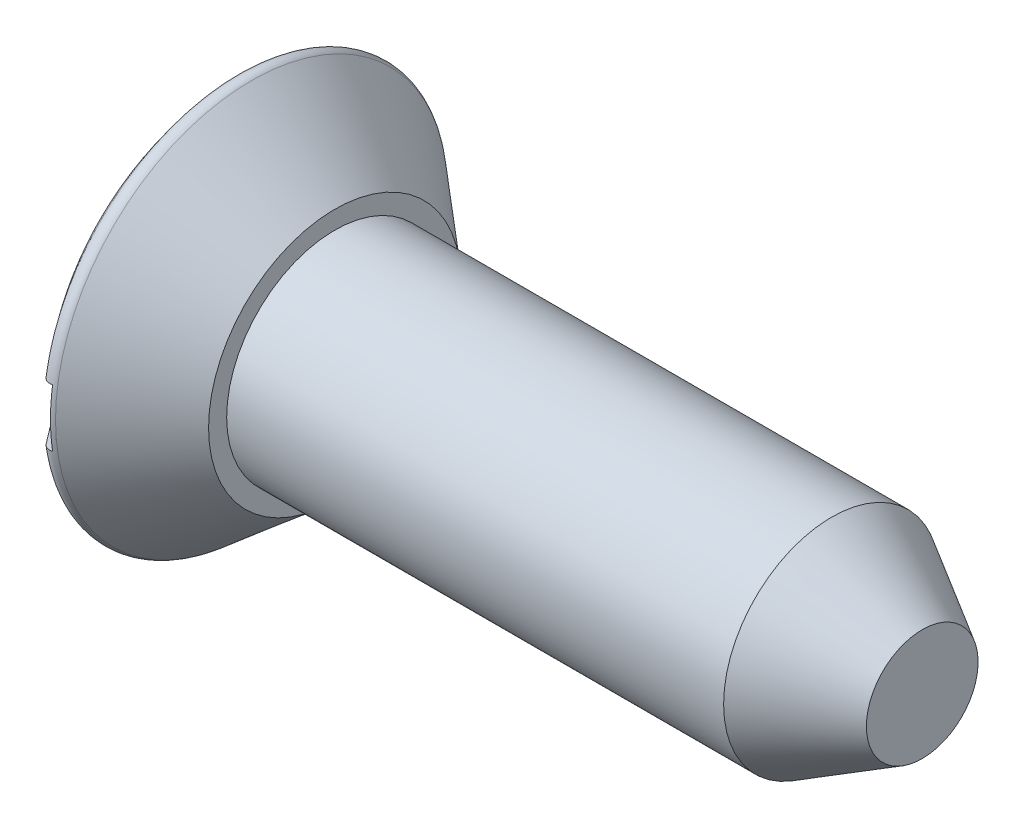
ISO-10303-21;
HEADER;
FILE_DESCRIPTION(('STEP AP214'),'2;1');
FILE_NAME('part.step','',(''),(''),'','','');
FILE_SCHEMA(('AUTOMOTIVE_DESIGN { 1 0 10303 214 1 1 1 1 }'));
ENDSEC;
DATA;
#1=APPLICATION_CONTEXT('core data for automotive mechanical design processes');
#2=APPLICATION_PROTOCOL_DEFINITION('international standard','automotive_design',2000,#1);
#3=PRODUCT_CONTEXT('',#1,'mechanical');
#4=PRODUCT('Part','Part','',(#3));
#5=PRODUCT_RELATED_PRODUCT_CATEGORY('part','',(#4));
#6=PRODUCT_DEFINITION_FORMATION('','',#4);
#7=PRODUCT_DEFINITION_CONTEXT('part definition',#1,'design');
#8=PRODUCT_DEFINITION('design','',#6,#7);
#9=PRODUCT_DEFINITION_SHAPE('','',#8);
#10=(LENGTH_UNIT() NAMED_UNIT(*) SI_UNIT(.MILLI.,.METRE.));
#11=(NAMED_UNIT(*) PLANE_ANGLE_UNIT() SI_UNIT($,.RADIAN.));
#12=(NAMED_UNIT(*) SI_UNIT($,.STERADIAN.) SOLID_ANGLE_UNIT());
#13=UNCERTAINTY_MEASURE_WITH_UNIT(LENGTH_MEASURE(1.E-05),#10,'distance_accuracy_value','');
#14=(GEOMETRIC_REPRESENTATION_CONTEXT(3) GLOBAL_UNCERTAINTY_ASSIGNED_CONTEXT((#13)) GLOBAL_UNIT_ASSIGNED_CONTEXT((#10,
#11,#12)) REPRESENTATION_CONTEXT('',''));
#15=CARTESIAN_POINT('',(0.,0.,0.));
#16=DIRECTION('',(0.,0.,1.));
#17=DIRECTION('',(1.,0.,0.));
#18=AXIS2_PLACEMENT_3D('',#15,#16,#17);
#19=CARTESIAN_POINT('',(0.,0.,0.));
#20=DIRECTION('',(-1.,0.,0.));
#21=DIRECTION('',(0.,0.,1.));
#22=AXIS2_PLACEMENT_3D('',#19,#20,#21);
#23=CYLINDRICAL_SURFACE('',#22,0.762);
#24=CARTESIAN_POINT('',(0.635,0.,0.));
#25=DIRECTION('',(-1.,0.,0.));
#26=DIRECTION('',(0.,0.,1.));
#27=AXIS2_PLACEMENT_3D('',#24,#25,#26);
#28=CIRCLE('',#27,0.762);
#29=CARTESIAN_POINT('',(0.635,0.,0.762));
#30=VERTEX_POINT('',#29);
#31=EDGE_CURVE('E152',#30,#30,#28,.T.);
#32=ORIENTED_EDGE('',*,*,#31,.F.);
#33=EDGE_LOOP('',(#32));
#34=FACE_BOUND('',#33,.T.);
#35=CARTESIAN_POINT('',(4.13728568757237,0.,0.));
#36=DIRECTION('',(-1.,0.,0.));
#37=DIRECTION('',(0.,0.,1.));
#38=AXIS2_PLACEMENT_3D('',#35,#36,#37);
#39=CIRCLE('',#38,0.762);
#40=CARTESIAN_POINT('',(4.13728568757237,0.,0.762));
#41=VERTEX_POINT('',#40);
#42=EDGE_CURVE('E182',#41,#41,#39,.T.);
#43=ORIENTED_EDGE('',*,*,#42,.T.);
#44=EDGE_LOOP('',(#43));
#45=FACE_BOUND('',#44,.T.);
#46=ADVANCED_FACE('F68',(#34,#45),#23,.T.);
#47=CARTESIAN_POINT('',(1.62983333333333,0.,0.));
#48=DIRECTION('',(-1.,0.,0.));
#49=DIRECTION('',(0.,1.,0.));
#50=AXIS2_PLACEMENT_3D('',#47,#48,#49);
#51=SPHERICAL_SURFACE('',#50,2.16323333333333);
#52=CARTESIAN_POINT('',(-0.0414603916577194,0.,0.));
#53=DIRECTION('',(-1.,0.,0.));
#54=DIRECTION('',(0.,0.,1.));
#55=AXIS2_PLACEMENT_3D('',#52,#53,#54);
#56=CIRCLE('',#55,1.37344666414462);
#57=CARTESIAN_POINT('',(-0.0414603916577233,0.2032,1.35833188111374));
#58=VERTEX_POINT('',#57);
#59=CARTESIAN_POINT('',(-0.0414603916577194,0.2032,-1.35833188111373));
#60=VERTEX_POINT('',#59);
#61=EDGE_CURVE('E162',#58,#60,#56,.T.);
#62=ORIENTED_EDGE('',*,*,#61,.T.);
#63=CARTESIAN_POINT('',(1.62983333333333,0.2032,0.));
#64=DIRECTION('',(0.,1.,0.));
#65=DIRECTION('',(0.,0.,1.));
#66=AXIS2_PLACEMENT_3D('',#63,#64,#65);
#67=CIRCLE('',#66,2.15366854795357);
#68=EDGE_CURVE('E95',#60,#58,#67,.T.);
#69=ORIENTED_EDGE('',*,*,#68,.T.);
#70=EDGE_LOOP('',(#62,#69));
#71=FACE_BOUND('',#70,.T.);
#72=ADVANCED_FACE('F178',(#71),#51,.T.);
#73=CARTESIAN_POINT('',(-0.0414603916577194,-0.2032,-1.35833188111373));
#74=VERTEX_POINT('',#73);
#75=CARTESIAN_POINT('',(-0.0414603916577194,-0.2032,1.35833188111373));
#76=VERTEX_POINT('',#75);
#77=EDGE_CURVE('E132',#74,#76,#56,.T.);
#78=ORIENTED_EDGE('',*,*,#77,.T.);
#79=CARTESIAN_POINT('',(1.62983333333333,-0.2032,0.));
#80=DIRECTION('',(0.,-1.,0.));
#81=DIRECTION('',(0.,0.,-1.));
#82=AXIS2_PLACEMENT_3D('',#79,#80,#81);
#83=CIRCLE('',#82,2.15366854795357);
#84=EDGE_CURVE('E87',#76,#74,#83,.T.);
#85=ORIENTED_EDGE('',*,*,#84,.T.);
#86=EDGE_LOOP('',(#78,#85));
#87=FACE_BOUND('',#86,.T.);
#88=ADVANCED_FACE('F70',(#87),#51,.T.);
#89=CARTESIAN_POINT('',(0.635,0.889571734202426,0.));
#90=DIRECTION('',(-1.,0.,0.));
#91=DIRECTION('',(0.,0.,1.));
#92=AXIS2_PLACEMENT_3D('',#89,#90,#91);
#93=PLANE('',#92);
#94=CARTESIAN_POINT('',(0.635,0.,0.));
#95=DIRECTION('',(-1.,0.,0.));
#96=DIRECTION('',(0.,0.,1.));
#97=AXIS2_PLACEMENT_3D('',#94,#95,#96);
#98=CIRCLE('',#97,0.889571734202426);
#99=CARTESIAN_POINT('',(0.635,0.,0.889571734202426));
#100=VERTEX_POINT('',#99);
#101=EDGE_CURVE('E167',#100,#100,#98,.T.);
#102=ORIENTED_EDGE('',*,*,#101,.F.);
#103=EDGE_LOOP('',(#102));
#104=FACE_BOUND('',#103,.T.);
#105=ORIENTED_EDGE('',*,*,#31,.T.);
#106=EDGE_LOOP('',(#105));
#107=FACE_BOUND('',#106,.T.);
#108=ADVANCED_FACE('F174',(#104,#107),#93,.F.);
#109=CARTESIAN_POINT('',(0.635,0.,0.));
#110=DIRECTION('',(-1.,0.,0.));
#111=DIRECTION('',(0.,0.,1.));
#112=AXIS2_PLACEMENT_3D('',#109,#110,#111);
#113=CONICAL_SURFACE('',#112,0.889571734202426,0.698131700797733);
#114=CARTESIAN_POINT('',(0.0484161242479158,0.,0.));
#115=DIRECTION('',(-1.,0.,0.));
#116=DIRECTION('',(0.,0.,1.));
#117=AXIS2_PLACEMENT_3D('',#114,#115,#116);
#118=CIRCLE('',#117,1.38177404800054);
#119=CARTESIAN_POINT('',(0.0484161242479158,0.,1.38177404800054));
#120=VERTEX_POINT('',#119);
#121=EDGE_CURVE('E165',#120,#120,#118,.T.);
#122=ORIENTED_EDGE('',*,*,#121,.F.);
#123=EDGE_LOOP('',(#122));
#124=FACE_BOUND('',#123,.T.);
#125=ORIENTED_EDGE('',*,*,#101,.T.);
#126=EDGE_LOOP('',(#125));
#127=FACE_BOUND('',#126,.T.);
#128=ADVANCED_FACE('F196',(#124,#127),#113,.T.);
#129=CARTESIAN_POINT('',(0.00759911103282043,0.,0.));
#130=DIRECTION('',(-1.,0.,0.));
#131=DIRECTION('',(0.,0.,1.));
#132=AXIS2_PLACEMENT_3D('',#129,#130,#131);
#133=TOROIDAL_SURFACE('',#132,1.33313022586249,0.0635000000000001);
#134=CARTESIAN_POINT('',(0.0253999999999999,0.,0.));
#135=DIRECTION('',(1.,0.,0.));
#136=DIRECTION('',(0.,0.,-1.));
#137=AXIS2_PLACEMENT_3D('',#134,#135,#136);
#138=CIRCLE('',#137,1.39408412936323);
#139=CARTESIAN_POINT('',(0.0253999999999999,-0.2032,-1.37919553354208));
#140=VERTEX_POINT('',#139);
#141=CARTESIAN_POINT('',(0.0253999999999999,0.2032,-1.37919553354208));
#142=VERTEX_POINT('',#141);
#143=EDGE_CURVE('E80',#140,#142,#138,.T.);
#144=ORIENTED_EDGE('',*,*,#143,.T.);
#145=CARTESIAN_POINT('',(-0.0280765606748768,0.2032,-1.37068105040169));
#146=CARTESIAN_POINT('',(-0.0310388679205371,0.2032,-1.36864704682959));
#147=CARTESIAN_POINT('',(-0.0338302754665,0.2032,-1.36635921237093));
#148=CARTESIAN_POINT('',(-0.0389903860065036,0.2032,-1.36134417556376));
#149=CARTESIAN_POINT('',(-0.0413585230776918,0.2032,-1.35861639412375));
#150=CARTESIAN_POINT('',(-0.0456025082425014,0.2032,-1.35280526417098));
#151=CARTESIAN_POINT('',(-0.0474788169070188,0.2032,-1.34972225223628));
#152=CARTESIAN_POINT('',(-0.0506912878001431,0.2032,-1.34328786635741));
#153=CARTESIAN_POINT('',(-0.0520275832813946,0.2032,-1.3399365588622));
#154=CARTESIAN_POINT('',(-0.0541344174369653,0.2032,-1.33303161601037));
#155=CARTESIAN_POINT('',(-0.0549004049946464,0.2032,-1.32947659186684));
#156=CARTESIAN_POINT('',(-0.0558294735501169,0.2032,-1.32228842416333));
#157=CARTESIAN_POINT('',(-0.0559925006292517,0.2032,-1.31865527364625));
#158=CARTESIAN_POINT('',(-0.0557106086385143,0.2032,-1.31138620185728));
#159=CARTESIAN_POINT('',(-0.0552612832926854,0.2032,-1.30775045065601));
#160=CARTESIAN_POINT('',(-0.0537590054653143,0.2032,-1.30060577782505));
#161=CARTESIAN_POINT('',(-0.0527060443568764,0.2032,-1.29709685800872));
#162=CARTESIAN_POINT('',(-0.0500240738926529,0.2032,-1.2903045704047));
#163=CARTESIAN_POINT('',(-0.0483948077919105,0.2032,-1.28702130392586));
#164=CARTESIAN_POINT('',(-0.0446044004369154,0.2032,-1.28077753225855));
#165=CARTESIAN_POINT('',(-0.0424432758356357,0.2032,-1.27781701696863));
#166=CARTESIAN_POINT('',(-0.0376660032020217,0.2032,-1.27232642500552));
#167=CARTESIAN_POINT('',(-0.0350532247429569,0.2032,-1.26979341751435));
#168=CARTESIAN_POINT('',(-0.029435011692653,0.2032,-1.26520842235457));
#169=CARTESIAN_POINT('',(-0.0264296023364173,0.2032,-1.26315640379572));
#170=CARTESIAN_POINT('',(-0.0201498097731999,0.2032,-1.25961788879214));
#171=CARTESIAN_POINT('',(-0.0168790665879256,0.2032,-1.2581249325384));
#172=CARTESIAN_POINT('',(-0.0101314985991322,0.2032,-1.25571637499513));
#173=CARTESIAN_POINT('',(-0.00665468820921032,0.2032,-1.2548007333767));
#174=CARTESIAN_POINT('',(0.000364825472034765,0.2032,-1.25358223307953));
#175=CARTESIAN_POINT('',(0.00390636824961993,0.2032,-1.25327268232582));
#176=CARTESIAN_POINT('',(0.0109908268871647,0.2032,-1.2532556924413));
#177=CARTESIAN_POINT('',(0.0145337426904779,0.2032,-1.25354823066725));
#178=CARTESIAN_POINT('',(0.0215028765950578,0.2032,-1.25472350981883));
#179=CARTESIAN_POINT('',(0.024929567849622,0.2032,-1.25560344941438));
#180=CARTESIAN_POINT('',(0.0315874578170289,0.2032,-1.2579239253121));
#181=CARTESIAN_POINT('',(0.0348186545514337,0.2032,-1.25936446728656));
#182=CARTESIAN_POINT('',(0.0410084024777361,0.2032,-1.26276984031255));
#183=CARTESIAN_POINT('',(0.0439658226680158,0.2032,-1.26473672608508));
#184=CARTESIAN_POINT('',(0.0495129281379218,0.2032,-1.26913422734472));
#185=CARTESIAN_POINT('',(0.0521025950569031,0.2032,-1.2715648659712));
#186=CARTESIAN_POINT('',(0.0568703559165243,0.2032,-1.27684798358896));
#187=CARTESIAN_POINT('',(0.0590438025306411,0.2032,-1.27970465596199));
#188=CARTESIAN_POINT('',(0.0628870373935519,0.2032,-1.28573874910478));
#189=CARTESIAN_POINT('',(0.0645567928447215,0.2032,-1.28891619074332));
#190=CARTESIAN_POINT('',(0.0673659648193111,0.2032,-1.29554283760898));
#191=CARTESIAN_POINT('',(0.0684987387378092,0.2032,-1.29899485948694));
#192=CARTESIAN_POINT('',(0.0701738961256293,0.2032,-1.30603933165563));
#193=CARTESIAN_POINT('',(0.0707162488452721,0.2032,-1.30963178925029));
#194=CARTESIAN_POINT('',(0.0711980469296698,0.2032,-1.31688608794474));
#195=CARTESIAN_POINT('',(0.0711326023890148,0.2032,-1.32054825480709));
#196=CARTESIAN_POINT('',(0.0703883960709238,0.2032,-1.32780981355696));
#197=CARTESIAN_POINT('',(0.0697096252768468,0.2032,-1.33140920452082));
#198=CARTESIAN_POINT('',(0.0677556833471742,0.2032,-1.33844529346164));
#199=CARTESIAN_POINT('',(0.0664800735838632,0.2032,-1.34188186973416));
#200=CARTESIAN_POINT('',(0.0633663619570054,0.2032,-1.34849009973695));
#201=CARTESIAN_POINT('',(0.0615282737359145,0.2032,-1.35166175989016));
#202=CARTESIAN_POINT('',(0.0573534868530262,0.2032,-1.35762753971678));
#203=CARTESIAN_POINT('',(0.0550200774896427,0.2032,-1.36042396050964));
#204=CARTESIAN_POINT('',(0.0499123916903922,0.2032,-1.36558019312128));
#205=CARTESIAN_POINT('',(0.0471381387907165,0.2032,-1.36794002823437));
#206=CARTESIAN_POINT('',(0.041258526754193,0.2032,-1.37212965180808));
#207=CARTESIAN_POINT('',(0.0381569335218169,0.2032,-1.37396472512534));
#208=CARTESIAN_POINT('',(0.0316874580432662,0.2032,-1.37708192659846));
#209=CARTESIAN_POINT('',(0.0283196023065038,0.2032,-1.3783641097189));
#210=CARTESIAN_POINT('',(0.0214497417901072,0.2032,-1.38032643506428));
#211=CARTESIAN_POINT('',(0.0179494359893005,0.2032,-1.38101252858432));
#212=CARTESIAN_POINT('',(0.0108822865252818,0.2032,-1.38178380384242));
#213=CARTESIAN_POINT('',(0.00731542872721301,0.2032,-1.38186885643576));
#214=CARTESIAN_POINT('',(0.00023700489406997,0.2032,-1.38143643711581));
#215=CARTESIAN_POINT('',(-0.00327474961133865,0.2032,-1.38092201237615));
#216=CARTESIAN_POINT('',(-0.0101589951476675,0.2032,-1.37931130423865));
#217=CARTESIAN_POINT('',(-0.0135316524495051,0.2032,-1.37821573859892));
#218=CARTESIAN_POINT('',(-0.0187672177826123,0.2032,-1.37601485477916));
#219=CARTESIAN_POINT('',(-0.0207041934593265,0.2032,-1.37508132393932));
#220=CARTESIAN_POINT('',(-0.0244733285264824,0.2032,-1.3730224553043));
#221=CARTESIAN_POINT('',(-0.0263054884417126,0.2032,-1.37189711846957));
#222=CARTESIAN_POINT('',(-0.0280765606748768,0.2032,-1.37068105040169));
#223=B_SPLINE_CURVE_WITH_KNOTS('',3,(#145,#146,#147,#148,#149,#150,#151,#152,#153,#154,#155,
#156,#157,#158,#159,#160,#161,#162,#163,#164,#165,#166,#167,#168,#169,#170,#171,#172,#173,#174,
#175,#176,#177,#178,#179,#180,#181,#182,#183,#184,#185,#186,#187,#188,#189,#190,#191,#192,#193,
#194,#195,#196,#197,#198,#199,#200,#201,#202,#203,#204,#205,#206,#207,#208,#209,#210,#211,#212,
#213,#214,#215,#216,#217,#218,#219,#220,#221,#222),.UNSPECIFIED.,.T.,.F.,(4,2,2,2,2,2,2,2,2,2,2,
2,2,2,2,2,2,2,2,2,2,2,2,2,2,2,2,2,2,2,2,2,2,2,2,2,2,2,4),(0.,0.0107722146404036,
0.021558725974208,0.0323350999387978,0.0431088131193548,0.0539676063176897,0.0648273705205705,
0.0757656918054064,0.0867041694197947,0.0976475262968263,0.108590540570994,0.119455184530107,
0.130319130544739,0.141053360662887,0.151786840847563,0.162401125041266,0.173015010062503,
0.18357863544707,0.194142367719457,0.204747955569302,0.215354072733335,0.226072470986027,
0.236791567011841,0.247640007886721,0.258489013731355,0.26942537811436,0.280361903277824,
0.291306478545819,0.302250788383111,0.313124574641122,0.323997780553591,0.334757280736064,
0.34551571103563,0.356165453598175,0.366817484384509,0.377415605674736,0.388000667763541,
0.394441075252375,0.40088145049274),.UNSPECIFIED.);
#224=EDGE_CURVE('E42',#142,#60,#223,.T.);
#225=ORIENTED_EDGE('',*,*,#224,.T.);
#226=ORIENTED_EDGE('',*,*,#61,.F.);
#227=CARTESIAN_POINT('',(0.00947622470481494,0.2032,1.25329211965426));
#228=CARTESIAN_POINT('',(0.00594649641936487,0.2032,1.25318653344214));
#229=CARTESIAN_POINT('',(0.00240523976672635,0.2032,1.2533798819006));
#230=CARTESIAN_POINT('',(-0.00459708761069851,0.2032,1.25435998755063));
#231=CARTESIAN_POINT('',(-0.00805805704335603,0.2032,1.25514745635103));
#232=CARTESIAN_POINT('',(-0.0147964383079594,0.2032,1.257291437433));
#233=CARTESIAN_POINT('',(-0.0180739824576047,0.2032,1.25864753336613));
#234=CARTESIAN_POINT('',(-0.0243556558523746,0.2032,1.26188748760626));
#235=CARTESIAN_POINT('',(-0.0273598455741683,0.2032,1.26377122879959));
#236=CARTESIAN_POINT('',(-0.0330294256675567,0.2032,1.26802277842461));
#237=CARTESIAN_POINT('',(-0.0356928593534142,0.2032,1.27039319524895));
#238=CARTESIAN_POINT('',(-0.0405898552652003,0.2032,1.27554288021782));
#239=CARTESIAN_POINT('',(-0.0428233773244971,0.2032,1.27832218652213));
#240=CARTESIAN_POINT('',(-0.0468253932187911,0.2032,1.28424605529686));
#241=CARTESIAN_POINT('',(-0.048588028808407,0.2032,1.28739457542439));
#242=CARTESIAN_POINT('',(-0.0515663369729376,0.2032,1.29394046781672));
#243=CARTESIAN_POINT('',(-0.0527819755367885,0.2032,1.29733785554028));
#244=CARTESIAN_POINT('',(-0.0546447315599405,0.2032,1.30432511403064));
#245=CARTESIAN_POINT('',(-0.0552854656446191,0.2032,1.30791668757239));
#246=CARTESIAN_POINT('',(-0.0559583473674688,0.2032,1.31515644913865));
#247=CARTESIAN_POINT('',(-0.0559904727956968,0.2032,1.3188046392244));
#248=CARTESIAN_POINT('',(-0.0554434725689991,0.2032,1.32607408419157));
#249=CARTESIAN_POINT('',(-0.0548611735080331,0.2032,1.32969510099563));
#250=CARTESIAN_POINT('',(-0.0530954490449355,0.2032,1.33678758296621));
#251=CARTESIAN_POINT('',(-0.0519120243287977,0.2032,1.34025904830338));
#252=CARTESIAN_POINT('',(-0.0489792730262507,0.2032,1.34694386883228));
#253=CARTESIAN_POINT('',(-0.0472313679619893,0.2032,1.35015784733792));
#254=CARTESIAN_POINT('',(-0.0432163083830823,0.2032,1.35624332183473));
#255=CARTESIAN_POINT('',(-0.0409491753420067,0.2032,1.35911483198181));
#256=CARTESIAN_POINT('',(-0.0359804531441518,0.2032,1.36440678302092));
#257=CARTESIAN_POINT('',(-0.0332827893085129,0.2032,1.36683090881118));
#258=CARTESIAN_POINT('',(-0.0275149486995246,0.2032,1.37118587439635));
#259=CARTESIAN_POINT('',(-0.0244447943448299,0.2032,1.37311674385661));
#260=CARTESIAN_POINT('',(-0.0180548888564763,0.2032,1.37640840753852));
#261=CARTESIAN_POINT('',(-0.0147382021898499,0.2032,1.37777515127574));
#262=CARTESIAN_POINT('',(-0.00792123245102401,0.2032,1.37992697505056));
#263=CARTESIAN_POINT('',(-0.00442095920455265,0.2032,1.38071208618375));
#264=CARTESIAN_POINT('',(0.00263179872080998,0.2032,1.38167253275387));
#265=CARTESIAN_POINT('',(0.00618358442831203,0.2032,1.38185300672147));
#266=CARTESIAN_POINT('',(0.0132667520813019,0.2032,1.38161315365063));
#267=CARTESIAN_POINT('',(0.016798134552476,0.2032,1.38119284216127));
#268=CARTESIAN_POINT('',(0.0237296079794192,0.2032,1.37976626420173));
#269=CARTESIAN_POINT('',(0.0271300525451877,0.2032,1.37876171415832));
#270=CARTESIAN_POINT('',(0.0337149332194815,0.2032,1.37619803137529));
#271=CARTESIAN_POINT('',(0.0368993672514844,0.2032,1.37463889330529));
#272=CARTESIAN_POINT('',(0.0429751546323062,0.2032,1.37100526044453));
#273=CARTESIAN_POINT('',(0.0458653791159777,0.2032,1.36892887879154));
#274=CARTESIAN_POINT('',(0.0512601020813583,0.2032,1.364324321515));
#275=CARTESIAN_POINT('',(0.0537645846890943,0.2032,1.36179612730779));
#276=CARTESIAN_POINT('',(0.0583409962553653,0.2032,1.35633601619111));
#277=CARTESIAN_POINT('',(0.0604088717874372,0.2032,1.35340070240949));
#278=CARTESIAN_POINT('',(0.0640286089938164,0.2032,1.34722755646379));
#279=CARTESIAN_POINT('',(0.0655804418493099,0.2032,1.34398970741731));
#280=CARTESIAN_POINT('',(0.0681413894409436,0.2032,1.3372661374494));
#281=CARTESIAN_POINT('',(0.06914449612779,0.2032,1.33377812778275));
#282=CARTESIAN_POINT('',(0.0705562458836786,0.2032,1.32668378426984));
#283=CARTESIAN_POINT('',(0.0709648568592397,0.2032,1.32307744404632));
#284=CARTESIAN_POINT('',(0.0711781615934804,0.2032,1.31581706513245));
#285=CARTESIAN_POINT('',(0.0709778446972978,0.2032,1.31216287839646));
#286=CARTESIAN_POINT('',(0.0699679522590829,0.2032,1.30493959362186));
#287=CARTESIAN_POINT('',(0.0691583611788936,0.2032,1.30137049775569));
#288=CARTESIAN_POINT('',(0.0669493040833112,0.2032,1.29441170102075));
#289=CARTESIAN_POINT('',(0.0655486523625603,0.2032,1.29102237625454));
#290=CARTESIAN_POINT('',(0.0621951084020283,0.2032,1.28452895725018));
#291=CARTESIAN_POINT('',(0.0602422485223987,0.2032,1.28142484631223));
#292=CARTESIAN_POINT('',(0.0558506714587473,0.2032,1.27561016216595));
#293=CARTESIAN_POINT('',(0.053414854817503,0.2032,1.27289739900047));
#294=CARTESIAN_POINT('',(0.0481169516060352,0.2032,1.26792439625764));
#295=CARTESIAN_POINT('',(0.0452547830827973,0.2032,1.265664243877));
#296=CARTESIAN_POINT('',(0.0392195121361584,0.2032,1.26168837970818));
#297=CARTESIAN_POINT('',(0.0360501316348076,0.2032,1.25996701174652));
#298=CARTESIAN_POINT('',(0.0294673770933425,0.2032,1.25709012701173));
#299=CARTESIAN_POINT('',(0.026054326761321,0.2032,1.2559338749591));
#300=CARTESIAN_POINT('',(0.0204268722890125,0.2032,1.25455054055639));
#301=CARTESIAN_POINT('',(0.0182565199363028,0.2032,1.2541371234401));
#302=CARTESIAN_POINT('',(0.0138843545569872,0.2032,1.25354091302269));
#303=CARTESIAN_POINT('',(0.0116825417486566,0.2032,1.25335811812228));
#304=CARTESIAN_POINT('',(0.00947622470481494,0.2032,1.25329211965426));
#305=B_SPLINE_CURVE_WITH_KNOTS('',3,(#227,#228,#229,#230,#231,#232,#233,#234,#235,#236,#237,
#238,#239,#240,#241,#242,#243,#244,#245,#246,#247,#248,#249,#250,#251,#252,#253,#254,#255,#256,
#257,#258,#259,#260,#261,#262,#263,#264,#265,#266,#267,#268,#269,#270,#271,#272,#273,#274,#275,
#276,#277,#278,#279,#280,#281,#282,#283,#284,#285,#286,#287,#288,#289,#290,#291,#292,#293,#294,
#295,#296,#297,#298,#299,#300,#301,#302,#303,#304),.UNSPECIFIED.,.T.,.F.,(4,2,2,2,2,2,2,2,2,2,2,
2,2,2,2,2,2,2,2,2,2,2,2,2,2,2,2,2,2,2,2,2,2,2,2,2,2,2,4),(0.,0.0105858151959136,
0.0211843297420327,0.0317750975755662,0.0423635165916464,0.0530102406074851,0.0636579588641391,
0.0744325518163428,0.0852078146163332,0.0961012894186986,0.10699516175565,0.117945575918895,
0.128895977585749,0.139819015292592,0.150741601339889,0.161569761365419,0.172397270012031,
0.183107474304921,0.193817105961279,0.204435487367151,0.215053593961022,0.225640662218946,
0.23622783223658,0.246854203928704,0.257481012798396,0.268202518724073,0.278924623300262,
0.289761888053789,0.300599737828607,0.311527009212501,0.322454559281128,0.333404135711715,
0.344353070615117,0.355238138374298,0.366125301158804,0.376894007127581,0.38764866424698,
0.39426555500087,0.400882399868498),.UNSPECIFIED.);
#306=CARTESIAN_POINT('',(0.0253999999999999,0.2032,1.37919553354208));
#307=VERTEX_POINT('',#306);
#308=EDGE_CURVE('E133',#58,#307,#305,.T.);
#309=ORIENTED_EDGE('',*,*,#308,.T.);
#310=CARTESIAN_POINT('',(0.0253999999999999,-0.2032,1.37919553354208));
#311=VERTEX_POINT('',#310);
#312=EDGE_CURVE('E123',#307,#311,#138,.T.);
#313=ORIENTED_EDGE('',*,*,#312,.T.);
#314=CARTESIAN_POINT('',(0.00947622470481494,-0.2032,1.25329211965426));
#315=CARTESIAN_POINT('',(0.0130099119072469,-0.2032,1.25339815430058));
#316=CARTESIAN_POINT('',(0.0165372189512018,-0.2032,1.25380395377672));
#317=CARTESIAN_POINT('',(0.0234760471513165,-0.2032,1.25520394368639));
#318=CARTESIAN_POINT('',(0.0268874218729581,-0.2032,1.25619885100199));
#319=CARTESIAN_POINT('',(0.0334924395961608,-0.2032,1.25874602609469));
#320=CARTESIAN_POINT('',(0.0366862519255334,-0.2032,1.26029785438696));
#321=CARTESIAN_POINT('',(0.0427692879974681,-0.2032,1.2639120233089));
#322=CARTESIAN_POINT('',(0.0456585795522559,-0.2032,1.26597424993656));
#323=CARTESIAN_POINT('',(0.0510724347903937,-0.2032,1.27056361393299));
#324=CARTESIAN_POINT('',(0.0535945615538538,-0.2032,1.27309362513296));
#325=CARTESIAN_POINT('',(0.0581845882783845,-0.2032,1.278536769039));
#326=CARTESIAN_POINT('',(0.0602524443041864,-0.2032,1.28144993875912));
#327=CARTESIAN_POINT('',(0.063901717957143,-0.2032,1.28761462235312));
#328=CARTESIAN_POINT('',(0.0654769066010441,-0.2032,1.29086982378404));
#329=CARTESIAN_POINT('',(0.0680647794107966,-0.2032,1.29759663155126));
#330=CARTESIAN_POINT('',(0.0690774300177438,-0.2032,1.30106825078449));
#331=CARTESIAN_POINT('',(0.0705210662175528,-0.2032,1.30816748205608));
#332=CARTESIAN_POINT('',(0.0709459977257022,-0.2032,1.31179632625781));
#333=CARTESIAN_POINT('',(0.0711832157638808,-0.2032,1.31907404396877));
#334=CARTESIAN_POINT('',(0.0709954839876041,-0.2032,1.32272291807324));
#335=CARTESIAN_POINT('',(0.0700099973997327,-0.2032,1.32995179459803));
#336=CARTESIAN_POINT('',(0.0692098961200483,-0.2032,1.33353147767142));
#337=CARTESIAN_POINT('',(0.0670178221817878,-0.2032,1.34050489818476));
#338=CARTESIAN_POINT('',(0.0656258547205063,-0.2032,1.34389863725722));
#339=CARTESIAN_POINT('',(0.0622938531109409,-0.2032,1.35038926282316));
#340=CARTESIAN_POINT('',(0.0603559237803003,-0.2032,1.35348722935237));
#341=CARTESIAN_POINT('',(0.0559828461173518,-0.2032,1.35930982943286));
#342=CARTESIAN_POINT('',(0.0535477209675722,-0.2032,1.36203448038065));
#343=CARTESIAN_POINT('',(0.0482734287325142,-0.2032,1.36700540299068));
#344=CARTESIAN_POINT('',(0.0454382613049129,-0.2032,1.36925591783981));
#345=CARTESIAN_POINT('',(0.0394269245466931,-0.2032,1.37324287148914));
#346=CARTESIAN_POINT('',(0.0362507759715642,-0.2032,1.37497934155506));
#347=CARTESIAN_POINT('',(0.029684341878315,-0.2032,1.3778695613928));
#348=CARTESIAN_POINT('',(0.0262967212547271,-0.2032,1.37902936677672));
#349=CARTESIAN_POINT('',(0.0193740610376129,-0.2032,1.38075880253838));
#350=CARTESIAN_POINT('',(0.0158390287862017,-0.2032,1.38132846227299));
#351=CARTESIAN_POINT('',(0.00875106414783311,-0.2032,1.38185818055034));
#352=CARTESIAN_POINT('',(0.00519847939364747,-0.2032,1.3818229009883));
#353=CARTESIAN_POINT('',(-0.00185006311422178,-0.2032,1.38115523335481));
#354=CARTESIAN_POINT('',(-0.00534602198201012,-0.2032,1.38052285704569));
#355=CARTESIAN_POINT('',(-0.0121760560535817,-0.2032,1.3786816875047));
#356=CARTESIAN_POINT('',(-0.0155104022959251,-0.2032,1.37747389894165));
#357=CARTESIAN_POINT('',(-0.0219303676936163,-0.2032,1.37451827044403));
#358=CARTESIAN_POINT('',(-0.0250159829086284,-0.2032,1.37277042195607));
#359=CARTESIAN_POINT('',(-0.0308674629574003,-0.2032,1.36877631784158));
#360=CARTESIAN_POINT('',(-0.0336317198469458,-0.2032,1.36652770730565));
#361=CARTESIAN_POINT('',(-0.0387479181160734,-0.2032,1.36160230873754));
#362=CARTESIAN_POINT('',(-0.0410998407841096,-0.2032,1.35892550128451));
#363=CARTESIAN_POINT('',(-0.0453488526201581,-0.2032,1.35319269114551));
#364=CARTESIAN_POINT('',(-0.0472413933516509,-0.2032,1.35013331766201));
#365=CARTESIAN_POINT('',(-0.0504922468101622,-0.2032,1.34374284977801));
#366=CARTESIAN_POINT('',(-0.0518505292806464,-0.2032,1.34041174000123));
#367=CARTESIAN_POINT('',(-0.0540090692439285,-0.2032,1.33353443337246));
#368=CARTESIAN_POINT('',(-0.0548032482093008,-0.2032,1.32998632821207));
#369=CARTESIAN_POINT('',(-0.0557894999603979,-0.2032,1.32280735959064));
#370=CARTESIAN_POINT('',(-0.0559815422632544,-0.2032,1.31917649194917));
#371=CARTESIAN_POINT('',(-0.0557579897857077,-0.2032,1.31190663508835));
#372=CARTESIAN_POINT('',(-0.0553379098386181,-0.2032,1.3082677829666));
#373=CARTESIAN_POINT('',(-0.0538933031545886,-0.2032,1.30111200187789));
#374=CARTESIAN_POINT('',(-0.0528687652818084,-0.2032,1.29759507515842));
#375=CARTESIAN_POINT('',(-0.0502417973655833,-0.2032,1.29078133506777));
#376=CARTESIAN_POINT('',(-0.0486389932460514,-0.2032,1.28748466581935));
#377=CARTESIAN_POINT('',(-0.0448990034031277,-0.2032,1.2812098632941));
#378=CARTESIAN_POINT('',(-0.0427618534617954,-0.2032,1.27823170870723));
#379=CARTESIAN_POINT('',(-0.0380290201447052,-0.2032,1.27270189468705));
#380=CARTESIAN_POINT('',(-0.0354367026777408,-0.2032,1.27014735523343));
#381=CARTESIAN_POINT('',(-0.0298547105771027,-0.2032,1.26551544370508));
#382=CARTESIAN_POINT('',(-0.0268649612073948,-0.2032,1.2634381615783));
#383=CARTESIAN_POINT('',(-0.0206104284588396,-0.2032,1.25984621626739));
#384=CARTESIAN_POINT('',(-0.0173491686701984,-0.2032,1.25832540970935));
#385=CARTESIAN_POINT('',(-0.0106183110215196,-0.2032,1.25586184134642));
#386=CARTESIAN_POINT('',(-0.00714899052133996,-0.2032,1.25491832798252));
#387=CARTESIAN_POINT('',(-0.00146806513464076,-0.2032,1.25388429723303));
#388=CARTESIAN_POINT('',(0.000710923081614564,-0.2032,1.25360500047255));
#389=CARTESIAN_POINT('',(0.00508616886804807,-0.2032,1.25327599806519));
#390=CARTESIAN_POINT('',(0.00728242631518643,-0.2032,1.25322629078401));
#391=CARTESIAN_POINT('',(0.00947622470481494,-0.2032,1.25329211965426));
#392=B_SPLINE_CURVE_WITH_KNOTS('',3,(#314,#315,#316,#317,#318,#319,#320,#321,#322,#323,#324,
#325,#326,#327,#328,#329,#330,#331,#332,#333,#334,#335,#336,#337,#338,#339,#340,#341,#342,#343,
#344,#345,#346,#347,#348,#349,#350,#351,#352,#353,#354,#355,#356,#357,#358,#359,#360,#361,#362,
#363,#364,#365,#366,#367,#368,#369,#370,#371,#372,#373,#374,#375,#376,#377,#378,#379,#380,#381,
#382,#383,#384,#385,#386,#387,#388,#389,#390,#391),.UNSPECIFIED.,.T.,.F.,(4,2,2,2,2,2,2,2,2,2,2,
2,2,2,2,2,2,2,2,2,2,2,2,2,2,2,2,2,2,2,2,2,2,2,2,2,2,2,4),(0.,0.0105977581410425,
0.0212084392160919,0.0318107653957365,0.0424107255851133,0.0530781115524876,0.0637465287734611,
0.074544835487715,0.0853437863191871,0.0962531687333943,0.107162877121632,0.118114599755599,
0.129066226222301,0.139976196042015,0.15088565728354,0.16169289715703,0.172499479567453,
0.183190048937913,0.193880086478819,0.204487779751518,0.215095264065516,0.225684295228725,
0.236273494107802,0.2469135832664,0.257554155142665,0.268296137408714,0.279038727935596,
0.289895388465929,0.300752598600413,0.311689763240757,0.322627129381184,0.333571583545094,
0.344515305018191,0.355381268144301,0.366249277484648,0.37699340245394,0.3877235100726,
0.394302901204276,0.400882245501499),.UNSPECIFIED.);
#393=EDGE_CURVE('E125',#311,#76,#392,.T.);
#394=ORIENTED_EDGE('',*,*,#393,.T.);
#395=ORIENTED_EDGE('',*,*,#77,.F.);
#396=CARTESIAN_POINT('',(-0.0280765606748768,-0.2032,-1.37068105040169));
#397=CARTESIAN_POINT('',(-0.0251555170788853,-0.2032,-1.37268633467932));
#398=CARTESIAN_POINT('',(-0.0220641221577845,-0.2032,-1.37444776276699));
#399=CARTESIAN_POINT('',(-0.0156272928020403,-0.2032,-1.37742868203035));
#400=CARTESIAN_POINT('',(-0.0122815857134644,-0.2032,-1.37864758167374));
#401=CARTESIAN_POINT('',(-0.00543309743993607,-0.2032,-1.38050488837677));
#402=CARTESIAN_POINT('',(-0.00193034894338737,-0.2032,-1.38114341565853));
#403=CARTESIAN_POINT('',(0.00513179775631249,-0.2032,-1.38182071043107));
#404=CARTESIAN_POINT('',(0.00869118243450546,-0.2032,-1.38185961902385));
#405=CARTESIAN_POINT('',(0.0157530892047787,-0.2032,-1.38133786584158));
#406=CARTESIAN_POINT('',(0.019255767241494,-0.2032,-1.38077931201021));
#407=CARTESIAN_POINT('',(0.02611787820388,-0.2032,-1.37908270632324));
#408=CARTESIAN_POINT('',(0.0294773067223526,-0.2032,-1.37794463665224));
#409=CARTESIAN_POINT('',(0.0359623805165961,-0.2032,-1.37512123829836));
#410=CARTESIAN_POINT('',(0.0390877424463835,-0.2032,-1.37343525911809));
#411=CARTESIAN_POINT('',(0.0450137294675208,-0.2032,-1.36956610750748));
#412=CARTESIAN_POINT('',(0.0478143453212036,-0.2032,-1.36738292093891));
#413=CARTESIAN_POINT('',(0.0530335977633415,-0.2032,-1.36256512768511));
#414=CARTESIAN_POINT('',(0.0554493268933329,-0.2032,-1.35992737199785));
#415=CARTESIAN_POINT('',(0.0598091898873716,-0.2032,-1.35428739083236));
#416=CARTESIAN_POINT('',(0.0617532995328784,-0.2032,-1.35128514664884));
#417=CARTESIAN_POINT('',(0.0651365309938076,-0.2032,-1.34496765312495));
#418=CARTESIAN_POINT('',(0.0665701209586518,-0.2032,-1.34164944129729));
#419=CARTESIAN_POINT('',(0.0688659625650904,-0.2032,-1.33482092879949));
#420=CARTESIAN_POINT('',(0.0697281813041983,-0.2032,-1.33131061707985));
#421=CARTESIAN_POINT('',(0.0708646486347187,-0.2032,-1.32416101254447));
#422=CARTESIAN_POINT('',(0.071133102156099,-0.2032,-1.32052079782786));
#423=CARTESIAN_POINT('',(0.0710582287910783,-0.2032,-1.31324660395615));
#424=CARTESIAN_POINT('',(0.070714879333014,-0.2032,-1.30961262503606));
#425=CARTESIAN_POINT('',(0.0694226029586761,-0.2032,-1.30243610486698));
#426=CARTESIAN_POINT('',(0.0684708204224793,-0.2032,-1.29889407719529));
#427=CARTESIAN_POINT('',(0.0659845125168968,-0.2032,-1.29202069946085));
#428=CARTESIAN_POINT('',(0.0644499883280745,-0.2032,-1.28868934897131));
#429=CARTESIAN_POINT('',(0.0608447738735759,-0.2032,-1.28234287773027));
#430=CARTESIAN_POINT('',(0.0587756020122055,-0.2032,-1.27932689486309));
#431=CARTESIAN_POINT('',(0.054155690005718,-0.2032,-1.27368944283191));
#432=CARTESIAN_POINT('',(0.0516049724385454,-0.2032,-1.27106795518181));
#433=CARTESIAN_POINT('',(0.0461202249964125,-0.2032,-1.26632179587888));
#434=CARTESIAN_POINT('',(0.0431901483981105,-0.2032,-1.26419255676456));
#435=CARTESIAN_POINT('',(0.0370104855046683,-0.2032,-1.26046347392396));
#436=CARTESIAN_POINT('',(0.0337609221579453,-0.2032,-1.25886359221046));
#437=CARTESIAN_POINT('',(0.0270776658258444,-0.2032,-1.25625919248971));
#438=CARTESIAN_POINT('',(0.0236467425159353,-0.2032,-1.25524756566844));
#439=CARTESIAN_POINT('',(0.016663097678332,-0.2032,-1.25382056190326));
#440=CARTESIAN_POINT('',(0.0131103834711226,-0.2032,-1.25340514918683));
#441=CARTESIAN_POINT('',(0.00601823868672279,-0.2032,-1.25318448817455));
#442=CARTESIAN_POINT('',(0.00247897696347928,-0.2032,-1.25337377447945));
#443=CARTESIAN_POINT('',(-0.00451725507163909,-0.2032,-1.25434468676968));
#444=CARTESIAN_POINT('',(-0.00797422686164993,-0.2032,-1.25512630210699));
#445=CARTESIAN_POINT('',(-0.0147041727221137,-0.2032,-1.25725671112364));
#446=CARTESIAN_POINT('',(-0.0179773554997055,-0.2032,-1.25860484607822));
#447=CARTESIAN_POINT('',(-0.0242531813123449,-0.2032,-1.26182770549609));
#448=CARTESIAN_POINT('',(-0.0272558168394405,-0.2032,-1.26370244456722));
#449=CARTESIAN_POINT('',(-0.0329291760461587,-0.2032,-1.26793864716126));
#450=CARTESIAN_POINT('',(-0.0355973594904983,-0.2032,-1.27030351155671));
#451=CARTESIAN_POINT('',(-0.0405046154891555,-0.2032,-1.27544288460724));
#452=CARTESIAN_POINT('',(-0.0427436616366925,-0.2032,-1.27821741845257));
#453=CARTESIAN_POINT('',(-0.0467574930741754,-0.2032,-1.28413264690833));
#454=CARTESIAN_POINT('',(-0.0485264320818419,-0.2032,-1.28727730854327));
#455=CARTESIAN_POINT('',(-0.0515179172360265,-0.2032,-1.29381658649281));
#456=CARTESIAN_POINT('',(-0.0527404279735051,-0.2032,-1.29721121898915));
#457=CARTESIAN_POINT('',(-0.0546174312791751,-0.2032,-1.3041942503292));
#458=CARTESIAN_POINT('',(-0.0552655214477033,-0.2032,-1.30778437110807));
#459=CARTESIAN_POINT('',(-0.0559532543173315,-0.2032,-1.31502234823766));
#460=CARTESIAN_POINT('',(-0.0559928967401483,-0.2032,-1.31867020461479));
#461=CARTESIAN_POINT('',(-0.0554610114828976,-0.2032,-1.32594001621671));
#462=CARTESIAN_POINT('',(-0.0548863473461164,-0.2032,-1.32956174255684));
#463=CARTESIAN_POINT('',(-0.0531354723835404,-0.2032,-1.33665788715898));
#464=CARTESIAN_POINT('',(-0.0519591146202651,-0.2032,-1.34013226921401));
#465=CARTESIAN_POINT('',(-0.0490393786399666,-0.2032,-1.34682557145354));
#466=CARTESIAN_POINT('',(-0.0472971257491161,-0.2032,-1.3500449829918));
#467=CARTESIAN_POINT('',(-0.0432934041638829,-0.2032,-1.35613919000183));
#468=CARTESIAN_POINT('',(-0.0410325825936396,-0.2032,-1.3590144082445));
#469=CARTESIAN_POINT('',(-0.0369701195896701,-0.2032,-1.36335974400167));
#470=CARTESIAN_POINT('',(-0.0353039044589128,-0.2032,-1.36495860334624));
#471=CARTESIAN_POINT('',(-0.031808050658886,-0.2032,-1.36796644929499));
#472=CARTESIAN_POINT('',(-0.0299784127937925,-0.2032,-1.36937543683342));
#473=CARTESIAN_POINT('',(-0.0280765606748768,-0.2032,-1.37068105040169));
#474=B_SPLINE_CURVE_WITH_KNOTS('',3,(#396,#397,#398,#399,#400,#401,#402,#403,#404,#405,#406,
#407,#408,#409,#410,#411,#412,#413,#414,#415,#416,#417,#418,#419,#420,#421,#422,#423,#424,#425,
#426,#427,#428,#429,#430,#431,#432,#433,#434,#435,#436,#437,#438,#439,#440,#441,#442,#443,#444,
#445,#446,#447,#448,#449,#450,#451,#452,#453,#454,#455,#456,#457,#458,#459,#460,#461,#462,#463,
#464,#465,#466,#467,#468,#469,#470,#471,#472,#473),.UNSPECIFIED.,.T.,.F.,(4,2,2,2,2,2,2,2,2,2,2,
2,2,2,2,2,2,2,2,2,2,2,2,2,2,2,2,2,2,2,2,2,2,2,2,2,2,2,4),(0.,0.010621002692905,
0.0212535575307462,0.0318839093694047,0.042511759640338,0.0531022364442943,0.0636930388388954,
0.0742964612241472,0.0849001851584452,0.0955805577540751,0.106261478690722,0.117054845544747,
0.127848833882216,0.138747713711197,0.149646995648286,0.16059781165099,0.171548605468799,
0.182468634372755,0.193388151402968,0.204201871485851,0.215014815396599,0.225694217695324,
0.236372979208912,0.246955497775081,0.257537826108709,0.268107883662873,0.278678234456239,
0.289324545618447,0.299971511686684,0.310745269359824,0.321519725080896,0.332412813476883,
0.343305906854996,0.354254883776013,0.365206535785605,0.376136541572567,0.387052981257466,
0.393968207000069,0.400883398715876),.UNSPECIFIED.);
#475=EDGE_CURVE('E121',#74,#140,#474,.T.);
#476=ORIENTED_EDGE('',*,*,#475,.T.);
#477=EDGE_LOOP('',(#144,#225,#226,#309,#313,#394,#395,#476));
#478=FACE_BOUND('',#477,.T.);
#479=ORIENTED_EDGE('',*,*,#121,.T.);
#480=EDGE_LOOP('',(#479));
#481=FACE_BOUND('',#480,.T.);
#482=ADVANCED_FACE('F129',(#478,#481),#133,.T.);
#483=CARTESIAN_POINT('',(-0.5334,0.2032,-1.39663022586249));
#484=DIRECTION('',(0.,1.,0.));
#485=DIRECTION('',(0.,0.,1.));
#486=AXIS2_PLACEMENT_3D('',#483,#484,#485);
#487=PLANE('',#486);
#488=DIRECTION('',(0.,0.,1.));
#489=VECTOR('',#488,1.);
#490=CARTESIAN_POINT('',(0.0253999999999999,0.2032,-1.39663022586249));
#491=LINE('',#490,#489);
#492=EDGE_CURVE('E118',#142,#307,#491,.T.);
#493=ORIENTED_EDGE('',*,*,#492,.T.);
#494=ORIENTED_EDGE('',*,*,#308,.F.);
#495=ORIENTED_EDGE('',*,*,#68,.F.);
#496=ORIENTED_EDGE('',*,*,#224,.F.);
#497=EDGE_LOOP('',(#493,#494,#495,#496));
#498=FACE_BOUND('',#497,.T.);
#499=ADVANCED_FACE('F155',(#498),#487,.F.);
#500=CARTESIAN_POINT('',(0.0253999999999999,0.2032,-1.39663022586249));
#501=DIRECTION('',(1.,0.,0.));
#502=DIRECTION('',(0.,0.,-1.));
#503=AXIS2_PLACEMENT_3D('',#500,#501,#502);
#504=PLANE('',#503);
#505=ORIENTED_EDGE('',*,*,#492,.F.);
#506=ORIENTED_EDGE('',*,*,#143,.F.);
#507=DIRECTION('',(0.,0.,1.));
#508=VECTOR('',#507,1.);
#509=CARTESIAN_POINT('',(0.0253999999999999,-0.2032,-1.39663022586249));
#510=LINE('',#509,#508);
#511=EDGE_CURVE('E115',#140,#311,#510,.T.);
#512=ORIENTED_EDGE('',*,*,#511,.T.);
#513=ORIENTED_EDGE('',*,*,#312,.F.);
#514=EDGE_LOOP('',(#505,#506,#512,#513));
#515=FACE_BOUND('',#514,.T.);
#516=ADVANCED_FACE('F114',(#515),#504,.F.);
#517=CARTESIAN_POINT('',(-0.5334,-0.2032,-1.39663022586249));
#518=DIRECTION('',(0.,-1.,0.));
#519=DIRECTION('',(0.,0.,-1.));
#520=AXIS2_PLACEMENT_3D('',#517,#518,#519);
#521=PLANE('',#520);
#522=ORIENTED_EDGE('',*,*,#84,.F.);
#523=ORIENTED_EDGE('',*,*,#393,.F.);
#524=ORIENTED_EDGE('',*,*,#511,.F.);
#525=ORIENTED_EDGE('',*,*,#475,.F.);
#526=EDGE_LOOP('',(#522,#523,#524,#525));
#527=FACE_BOUND('',#526,.T.);
#528=ADVANCED_FACE('F124',(#527),#521,.F.);
#529=CARTESIAN_POINT('',(4.13728568757237,0.,0.));
#530=DIRECTION('',(-1.,0.,0.));
#531=DIRECTION('',(0.,0.,1.));
#532=AXIS2_PLACEMENT_3D('',#529,#530,#531);
#533=CONICAL_SURFACE('',#532,0.762,0.523598775598293);
#534=CARTESIAN_POINT('',(4.7752,0.,0.));
#535=DIRECTION('',(-1.,0.,0.));
#536=DIRECTION('',(0.,0.,1.));
#537=AXIS2_PLACEMENT_3D('',#534,#535,#536);
#538=CIRCLE('',#537,0.3937);
#539=CARTESIAN_POINT('',(4.7752,0.,0.3937));
#540=VERTEX_POINT('',#539);
#541=EDGE_CURVE('E126',#540,#540,#538,.T.);
#542=ORIENTED_EDGE('',*,*,#541,.T.);
#543=EDGE_LOOP('',(#542));
#544=FACE_BOUND('',#543,.T.);
#545=ORIENTED_EDGE('',*,*,#42,.F.);
#546=EDGE_LOOP('',(#545));
#547=FACE_BOUND('',#546,.T.);
#548=ADVANCED_FACE('F146',(#544,#547),#533,.T.);
#549=CARTESIAN_POINT('',(4.7752,0.762,0.));
#550=DIRECTION('',(-1.,0.,0.));
#551=DIRECTION('',(0.,0.,1.));
#552=AXIS2_PLACEMENT_3D('',#549,#550,#551);
#553=PLANE('',#552);
#554=ORIENTED_EDGE('',*,*,#541,.F.);
#555=EDGE_LOOP('',(#554));
#556=FACE_BOUND('',#555,.T.);
#557=ADVANCED_FACE('F188',(#556),#553,.F.);
#558=CLOSED_SHELL('',(#46,#72,#88,#108,#128,#482,#499,#516,#528,#548,#557));
#559=MANIFOLD_SOLID_BREP('B6',#558);
#560=ADVANCED_BREP_SHAPE_REPRESENTATION('',(#18,#559),#14);
#561=SHAPE_DEFINITION_REPRESENTATION(#9,#560);
ENDSEC;
END-ISO-10303-21;
